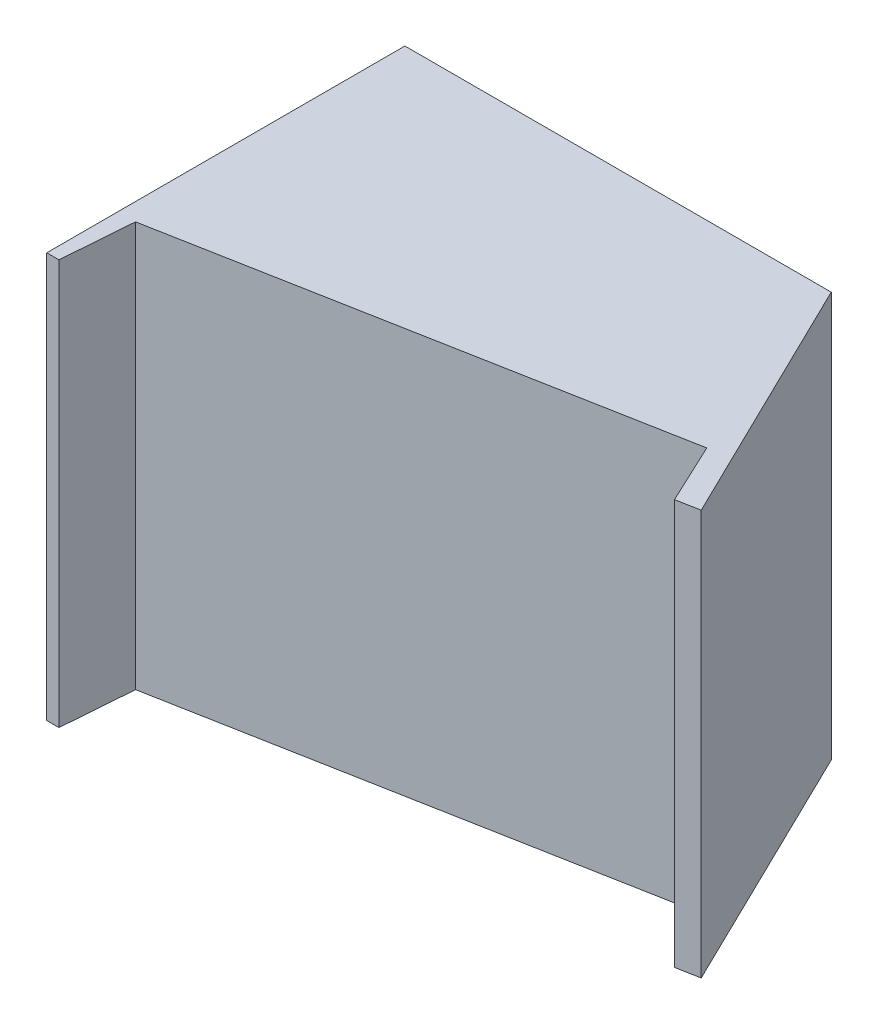
ISO-10303-21;
HEADER;
FILE_DESCRIPTION(('STEP AP214'),'2;1');
FILE_NAME('part.step','',(''),(''),'','','');
FILE_SCHEMA(('AUTOMOTIVE_DESIGN { 1 0 10303 214 1 1 1 1 }'));
ENDSEC;
DATA;
#1=APPLICATION_CONTEXT('core data for automotive mechanical design processes');
#2=APPLICATION_PROTOCOL_DEFINITION('international standard','automotive_design',2000,#1);
#3=PRODUCT_CONTEXT('',#1,'mechanical');
#4=PRODUCT('Part','Part','',(#3));
#5=PRODUCT_RELATED_PRODUCT_CATEGORY('part','',(#4));
#6=PRODUCT_DEFINITION_FORMATION('','',#4);
#7=PRODUCT_DEFINITION_CONTEXT('part definition',#1,'design');
#8=PRODUCT_DEFINITION('design','',#6,#7);
#9=PRODUCT_DEFINITION_SHAPE('','',#8);
#10=(LENGTH_UNIT() NAMED_UNIT(*) SI_UNIT(.MILLI.,.METRE.));
#11=(NAMED_UNIT(*) PLANE_ANGLE_UNIT() SI_UNIT($,.RADIAN.));
#12=(NAMED_UNIT(*) SI_UNIT($,.STERADIAN.) SOLID_ANGLE_UNIT());
#13=UNCERTAINTY_MEASURE_WITH_UNIT(LENGTH_MEASURE(1.E-05),#10,'distance_accuracy_value','');
#14=(GEOMETRIC_REPRESENTATION_CONTEXT(3) GLOBAL_UNCERTAINTY_ASSIGNED_CONTEXT((#13)) GLOBAL_UNIT_ASSIGNED_CONTEXT((#10,
#11,#12)) REPRESENTATION_CONTEXT('',''));
#15=CARTESIAN_POINT('',(0.,0.,0.));
#16=DIRECTION('',(0.,0.,1.));
#17=DIRECTION('',(1.,0.,0.));
#18=AXIS2_PLACEMENT_3D('',#15,#16,#17);
#19=CARTESIAN_POINT('',(0.,0.,378.));
#20=DIRECTION('',(0.,0.,-1.));
#21=DIRECTION('',(-1.,0.,0.));
#22=AXIS2_PLACEMENT_3D('',#19,#20,#21);
#23=PLANE('',#22);
#24=DIRECTION('',(0.,-1.,0.));
#25=VECTOR('',#24,1.);
#26=CARTESIAN_POINT('',(12.8563623155751,2028.64487270543,378.));
#27=LINE('',#26,#25);
#28=CARTESIAN_POINT('',(12.8563623155751,427.573746212538,378.));
#29=VERTEX_POINT('',#28);
#30=CARTESIAN_POINT('',(12.8563623155751,0.,378.));
#31=VERTEX_POINT('',#30);
#32=EDGE_CURVE('E156',#29,#31,#27,.T.);
#33=ORIENTED_EDGE('',*,*,#32,.F.);
#34=DIRECTION('',(-1.,0.,0.));
#35=VECTOR('',#34,1.);
#36=CARTESIAN_POINT('',(0.,427.573746212538,378.));
#37=LINE('',#36,#35);
#38=CARTESIAN_POINT('',(0.,427.573746212538,378.));
#39=VERTEX_POINT('',#38);
#40=EDGE_CURVE('E70',#29,#39,#37,.T.);
#41=ORIENTED_EDGE('',*,*,#40,.T.);
#42=DIRECTION('',(0.,-1.,0.));
#43=VECTOR('',#42,1.);
#44=CARTESIAN_POINT('',(0.,0.,378.));
#45=LINE('',#44,#43);
#46=CARTESIAN_POINT('',(0.,0.,378.));
#47=VERTEX_POINT('',#46);
#48=EDGE_CURVE('E100',#39,#47,#45,.T.);
#49=ORIENTED_EDGE('',*,*,#48,.T.);
#50=DIRECTION('',(1.,0.,0.));
#51=VECTOR('',#50,1.);
#52=CARTESIAN_POINT('',(0.,0.,378.));
#53=LINE('',#52,#51);
#54=EDGE_CURVE('E166',#47,#31,#53,.T.);
#55=ORIENTED_EDGE('',*,*,#54,.T.);
#56=EDGE_LOOP('',(#33,#41,#49,#55));
#57=FACE_BOUND('',#56,.T.);
#58=ADVANCED_FACE('F43',(#57),#23,.F.);
#59=CARTESIAN_POINT('',(0.,0.,378.));
#60=DIRECTION('',(1.,0.,0.));
#61=DIRECTION('',(0.,0.,-1.));
#62=AXIS2_PLACEMENT_3D('',#59,#60,#61);
#63=PLANE('',#62);
#64=DIRECTION('',(0.,-1.,0.));
#65=VECTOR('',#64,1.);
#66=CARTESIAN_POINT('',(0.,0.,0.));
#67=LINE('',#66,#65);
#68=CARTESIAN_POINT('',(0.,427.573746212538,0.));
#69=VERTEX_POINT('',#68);
#70=CARTESIAN_POINT('',(0.,0.,0.));
#71=VERTEX_POINT('',#70);
#72=EDGE_CURVE('E102',#69,#71,#67,.T.);
#73=ORIENTED_EDGE('',*,*,#72,.T.);
#74=DIRECTION('',(0.,0.,-1.));
#75=VECTOR('',#74,1.);
#76=CARTESIAN_POINT('',(0.,0.,378.));
#77=LINE('',#76,#75);
#78=EDGE_CURVE('E117',#47,#71,#77,.T.);
#79=ORIENTED_EDGE('',*,*,#78,.F.);
#80=ORIENTED_EDGE('',*,*,#48,.F.);
#81=DIRECTION('',(0.,0.,-1.));
#82=VECTOR('',#81,1.);
#83=CARTESIAN_POINT('',(0.,427.573746212538,378.));
#84=LINE('',#83,#82);
#85=EDGE_CURVE('E90',#39,#69,#84,.T.);
#86=ORIENTED_EDGE('',*,*,#85,.T.);
#87=EDGE_LOOP('',(#73,#79,#80,#86));
#88=FACE_BOUND('',#87,.T.);
#89=ADVANCED_FACE('F105',(#88),#63,.F.);
#90=CARTESIAN_POINT('',(0.,0.,378.));
#91=DIRECTION('',(0.,1.,0.));
#92=DIRECTION('',(0.,0.,1.));
#93=AXIS2_PLACEMENT_3D('',#90,#91,#92);
#94=PLANE('',#93);
#95=DIRECTION('',(-0.983027601832894,0.,0.18345771729385));
#96=VECTOR('',#95,1.);
#97=CARTESIAN_POINT('',(-12.9216931694108,0.,308.761260767239));
#98=LINE('',#97,#96);
#99=CARTESIAN_POINT('',(526.667256983761,0.,208.060368048142));
#100=VERTEX_POINT('',#99);
#101=CARTESIAN_POINT('',(18.6039169274223,0.,302.8777876543));
#102=VERTEX_POINT('',#101);
#103=EDGE_CURVE('E111',#100,#102,#98,.T.);
#104=ORIENTED_EDGE('',*,*,#103,.T.);
#105=DIRECTION('',(-0.0762864369454692,0.,0.997085943907628));
#106=VECTOR('',#105,1.);
#107=CARTESIAN_POINT('',(12.7815431663786,0.,378.977908065785));
#108=LINE('',#107,#106);
#109=EDGE_CURVE('E109',#102,#31,#108,.T.);
#110=ORIENTED_EDGE('',*,*,#109,.T.);
#111=ORIENTED_EDGE('',*,*,#54,.F.);
#112=ORIENTED_EDGE('',*,*,#78,.T.);
#113=DIRECTION('',(1.,0.,0.));
#114=VECTOR('',#113,1.);
#115=CARTESIAN_POINT('',(0.,0.,0.));
#116=LINE('',#115,#114);
#117=CARTESIAN_POINT('',(449.978341511889,0.,0.));
#118=VERTEX_POINT('',#117);
#119=EDGE_CURVE('E107',#71,#118,#116,.T.);
#120=ORIENTED_EDGE('',*,*,#119,.T.);
#121=DIRECTION('',(0.438371146789078,0.,0.898794046299167));
#122=VECTOR('',#121,1.);
#123=CARTESIAN_POINT('',(449.978341511889,0.,0.));
#124=LINE('',#123,#122);
#125=CARTESIAN_POINT('',(580.648945557762,0.,267.914441456742));
#126=VERTEX_POINT('',#125);
#127=EDGE_CURVE('E122',#126,#118,#124,.F.);
#128=ORIENTED_EDGE('',*,*,#127,.F.);
#129=DIRECTION('',(-0.983027601832893,0.,0.183457717293853));
#130=VECTOR('',#129,1.);
#131=CARTESIAN_POINT('',(-0.310522827366741,0.,376.33611518336));
#132=LINE('',#131,#130);
#133=CARTESIAN_POINT('',(556.854417648471,0.,272.355099853499));
#134=VERTEX_POINT('',#133);
#135=EDGE_CURVE('E158',#126,#134,#132,.T.);
#136=ORIENTED_EDGE('',*,*,#135,.T.);
#137=DIRECTION('',(-0.424999439988879,0.,-0.905193612443846));
#138=VECTOR('',#137,1.);
#139=CARTESIAN_POINT('',(496.915162715104,0.,144.69227116425));
#140=LINE('',#139,#138);
#141=EDGE_CURVE('E164',#134,#100,#140,.T.);
#142=ORIENTED_EDGE('',*,*,#141,.T.);
#143=EDGE_LOOP('',(#104,#110,#111,#112,#120,#128,#136,#142));
#144=FACE_BOUND('',#143,.T.);
#145=ADVANCED_FACE('F171',(#144),#94,.F.);
#146=CARTESIAN_POINT('',(449.978341511889,0.,0.));
#147=DIRECTION('',(0.898794046299166,0.,-0.438371146789078));
#148=DIRECTION('',(-0.438371146789078,0.,-0.898794046299167));
#149=AXIS2_PLACEMENT_3D('',#146,#147,#148);
#150=PLANE('',#149);
#151=DIRECTION('',(0.438371146789078,0.,0.898794046299167));
#152=VECTOR('',#151,1.);
#153=CARTESIAN_POINT('',(512.440367987516,427.573746212538,128.066132835806));
#154=LINE('',#153,#152);
#155=CARTESIAN_POINT('',(580.648945557762,427.573746212538,267.914441456742));
#156=VERTEX_POINT('',#155);
#157=CARTESIAN_POINT('',(449.978341511889,427.573746212538,0.));
#158=VERTEX_POINT('',#157);
#159=EDGE_CURVE('E95',#156,#158,#154,.F.);
#160=ORIENTED_EDGE('',*,*,#159,.F.);
#161=DIRECTION('',(0.,-1.,0.));
#162=VECTOR('',#161,1.);
#163=CARTESIAN_POINT('',(580.648945557762,2028.64487270543,267.914441456742));
#164=LINE('',#163,#162);
#165=EDGE_CURVE('E59',#156,#126,#164,.T.);
#166=ORIENTED_EDGE('',*,*,#165,.T.);
#167=ORIENTED_EDGE('',*,*,#127,.T.);
#168=DIRECTION('',(0.,1.,0.));
#169=VECTOR('',#168,1.);
#170=CARTESIAN_POINT('',(449.978341511889,0.,0.));
#171=LINE('',#170,#169);
#172=EDGE_CURVE('E98',#118,#158,#171,.T.);
#173=ORIENTED_EDGE('',*,*,#172,.T.);
#174=EDGE_LOOP('',(#160,#166,#167,#173));
#175=FACE_BOUND('',#174,.T.);
#176=ADVANCED_FACE('F44',(#175),#150,.T.);
#177=CARTESIAN_POINT('',(0.,427.573746212538,378.));
#178=DIRECTION('',(0.,-1.,0.));
#179=DIRECTION('',(0.,0.,-1.));
#180=AXIS2_PLACEMENT_3D('',#177,#178,#179);
#181=PLANE('',#180);
#182=ORIENTED_EDGE('',*,*,#40,.F.);
#183=DIRECTION('',(0.0762864369454692,0.,-0.997085943907628));
#184=VECTOR('',#183,1.);
#185=CARTESIAN_POINT('',(12.7815431663786,427.573746212538,378.977908065785));
#186=LINE('',#185,#184);
#187=CARTESIAN_POINT('',(18.6039169274223,427.573746212538,302.8777876543));
#188=VERTEX_POINT('',#187);
#189=EDGE_CURVE('E11',#29,#188,#186,.T.);
#190=ORIENTED_EDGE('',*,*,#189,.T.);
#191=DIRECTION('',(0.983027601832894,0.,-0.18345771729385));
#192=VECTOR('',#191,1.);
#193=CARTESIAN_POINT('',(-12.9216931694108,427.573746212538,308.761260767239));
#194=LINE('',#193,#192);
#195=CARTESIAN_POINT('',(526.667256983761,427.573746212538,208.060368048142));
#196=VERTEX_POINT('',#195);
#197=EDGE_CURVE('E51',#188,#196,#194,.T.);
#198=ORIENTED_EDGE('',*,*,#197,.T.);
#199=DIRECTION('',(0.424999439988879,0.,0.905193612443846));
#200=VECTOR('',#199,1.);
#201=CARTESIAN_POINT('',(496.915162715104,427.573746212538,144.69227116425));
#202=LINE('',#201,#200);
#203=CARTESIAN_POINT('',(556.854417648471,427.573746212538,272.355099853499));
#204=VERTEX_POINT('',#203);
#205=EDGE_CURVE('E130',#196,#204,#202,.T.);
#206=ORIENTED_EDGE('',*,*,#205,.T.);
#207=DIRECTION('',(0.983027601832893,0.,-0.183457717293853));
#208=VECTOR('',#207,1.);
#209=CARTESIAN_POINT('',(-0.310522827366741,427.573746212538,376.33611518336));
#210=LINE('',#209,#208);
#211=EDGE_CURVE('E125',#204,#156,#210,.T.);
#212=ORIENTED_EDGE('',*,*,#211,.T.);
#213=ORIENTED_EDGE('',*,*,#159,.T.);
#214=DIRECTION('',(-1.,0.,0.));
#215=VECTOR('',#214,1.);
#216=CARTESIAN_POINT('',(0.,427.573746212538,0.));
#217=LINE('',#216,#215);
#218=EDGE_CURVE('E88',#158,#69,#217,.T.);
#219=ORIENTED_EDGE('',*,*,#218,.T.);
#220=ORIENTED_EDGE('',*,*,#85,.F.);
#221=EDGE_LOOP('',(#182,#190,#198,#206,#212,#213,#219,#220));
#222=FACE_BOUND('',#221,.T.);
#223=ADVANCED_FACE('F86',(#222),#181,.F.);
#224=CARTESIAN_POINT('',(0.,0.,0.));
#225=DIRECTION('',(0.,0.,-1.));
#226=DIRECTION('',(-1.,0.,0.));
#227=AXIS2_PLACEMENT_3D('',#224,#225,#226);
#228=PLANE('',#227);
#229=ORIENTED_EDGE('',*,*,#72,.F.);
#230=ORIENTED_EDGE('',*,*,#218,.F.);
#231=ORIENTED_EDGE('',*,*,#172,.F.);
#232=ORIENTED_EDGE('',*,*,#119,.F.);
#233=EDGE_LOOP('',(#229,#230,#231,#232));
#234=FACE_BOUND('',#233,.T.);
#235=ADVANCED_FACE('F106',(#234),#228,.T.);
#236=CARTESIAN_POINT('',(12.8563623155751,2028.64487270543,378.));
#237=DIRECTION('',(-0.997085943907628,0.,-0.0762864369454692));
#238=DIRECTION('',(-0.0762864369454692,0.,0.997085943907628));
#239=AXIS2_PLACEMENT_3D('',#236,#237,#238);
#240=PLANE('',#239);
#241=ORIENTED_EDGE('',*,*,#109,.F.);
#242=DIRECTION('',(0.,-1.,0.));
#243=VECTOR('',#242,1.);
#244=CARTESIAN_POINT('',(18.6039169274223,2028.64487270543,302.8777876543));
#245=LINE('',#244,#243);
#246=EDGE_CURVE('E148',#188,#102,#245,.T.);
#247=ORIENTED_EDGE('',*,*,#246,.F.);
#248=ORIENTED_EDGE('',*,*,#189,.F.);
#249=ORIENTED_EDGE('',*,*,#32,.T.);
#250=EDGE_LOOP('',(#241,#247,#248,#249));
#251=FACE_BOUND('',#250,.T.);
#252=ADVANCED_FACE('F153',(#251),#240,.F.);
#253=CARTESIAN_POINT('',(18.6039169274223,2028.64487270543,302.8777876543));
#254=DIRECTION('',(-0.18345771729385,0.,-0.983027601832893));
#255=DIRECTION('',(-0.983027601832894,0.,0.18345771729385));
#256=AXIS2_PLACEMENT_3D('',#253,#254,#255);
#257=PLANE('',#256);
#258=ORIENTED_EDGE('',*,*,#103,.F.);
#259=DIRECTION('',(0.,-1.,0.));
#260=VECTOR('',#259,1.);
#261=CARTESIAN_POINT('',(526.667256983761,2028.64487270543,208.060368048142));
#262=LINE('',#261,#260);
#263=EDGE_CURVE('E149',#196,#100,#262,.T.);
#264=ORIENTED_EDGE('',*,*,#263,.F.);
#265=ORIENTED_EDGE('',*,*,#197,.F.);
#266=ORIENTED_EDGE('',*,*,#246,.T.);
#267=EDGE_LOOP('',(#258,#264,#265,#266));
#268=FACE_BOUND('',#267,.T.);
#269=ADVANCED_FACE('F145',(#268),#257,.F.);
#270=CARTESIAN_POINT('',(526.667256983761,2028.64487270543,208.060368048142));
#271=DIRECTION('',(0.905193612443846,0.,-0.424999439988879));
#272=DIRECTION('',(-0.424999439988879,0.,-0.905193612443846));
#273=AXIS2_PLACEMENT_3D('',#270,#271,#272);
#274=PLANE('',#273);
#275=ORIENTED_EDGE('',*,*,#141,.F.);
#276=DIRECTION('',(0.,-1.,0.));
#277=VECTOR('',#276,1.);
#278=CARTESIAN_POINT('',(556.854417648471,2028.64487270543,272.355099853499));
#279=LINE('',#278,#277);
#280=EDGE_CURVE('E179',#204,#134,#279,.T.);
#281=ORIENTED_EDGE('',*,*,#280,.F.);
#282=ORIENTED_EDGE('',*,*,#205,.F.);
#283=ORIENTED_EDGE('',*,*,#263,.T.);
#284=EDGE_LOOP('',(#275,#281,#282,#283));
#285=FACE_BOUND('',#284,.T.);
#286=ADVANCED_FACE('F180',(#285),#274,.F.);
#287=CARTESIAN_POINT('',(556.854417648471,2028.64487270543,272.355099853499));
#288=DIRECTION('',(-0.183457717293853,0.,-0.983027601832893));
#289=DIRECTION('',(-0.983027601832893,0.,0.183457717293853));
#290=AXIS2_PLACEMENT_3D('',#287,#288,#289);
#291=PLANE('',#290);
#292=ORIENTED_EDGE('',*,*,#135,.F.);
#293=ORIENTED_EDGE('',*,*,#165,.F.);
#294=ORIENTED_EDGE('',*,*,#211,.F.);
#295=ORIENTED_EDGE('',*,*,#280,.T.);
#296=EDGE_LOOP('',(#292,#293,#294,#295));
#297=FACE_BOUND('',#296,.T.);
#298=ADVANCED_FACE('F190',(#297),#291,.F.);
#299=CLOSED_SHELL('',(#58,#89,#145,#176,#223,#235,#252,#269,#286,#298));
#300=MANIFOLD_SOLID_BREP('B2',#299);
#301=ADVANCED_BREP_SHAPE_REPRESENTATION('',(#18,#300),#14);
#302=SHAPE_DEFINITION_REPRESENTATION(#9,#301);
ENDSEC;
END-ISO-10303-21;
